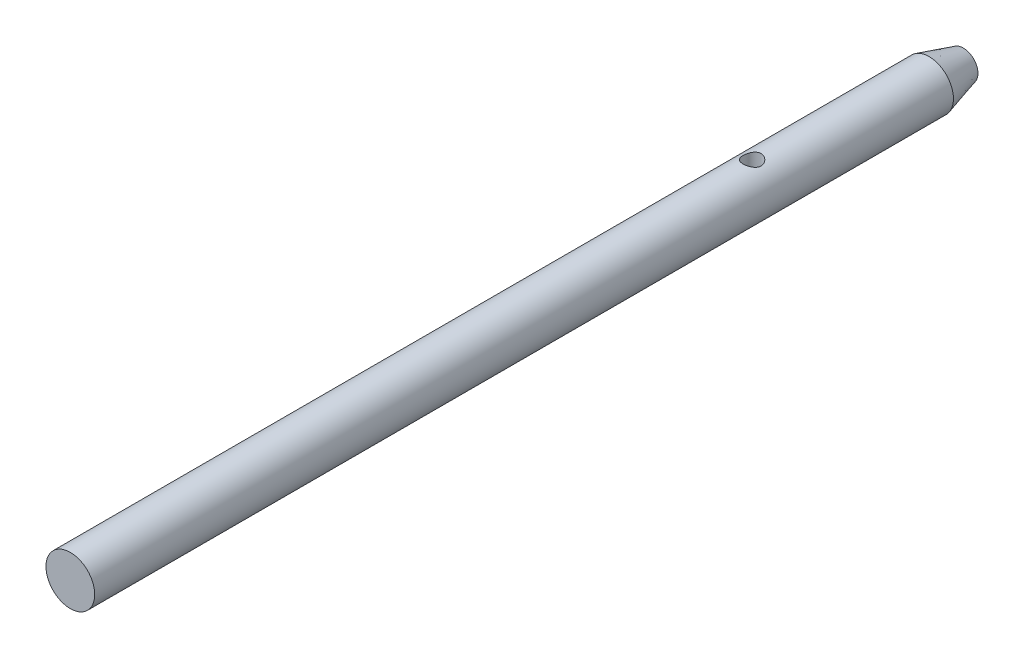
ISO-10303-21;
HEADER;
FILE_DESCRIPTION(('STEP AP214'),'2;1');
FILE_NAME('part.step','',(''),(''),'','','');
FILE_SCHEMA(('AUTOMOTIVE_DESIGN { 1 0 10303 214 1 1 1 1 }'));
ENDSEC;
DATA;
#1=APPLICATION_CONTEXT('core data for automotive mechanical design processes');
#2=APPLICATION_PROTOCOL_DEFINITION('international standard','automotive_design',2000,#1);
#3=PRODUCT_CONTEXT('',#1,'mechanical');
#4=PRODUCT('Part','Part','',(#3));
#5=PRODUCT_RELATED_PRODUCT_CATEGORY('part','',(#4));
#6=PRODUCT_DEFINITION_FORMATION('','',#4);
#7=PRODUCT_DEFINITION_CONTEXT('part definition',#1,'design');
#8=PRODUCT_DEFINITION('design','',#6,#7);
#9=PRODUCT_DEFINITION_SHAPE('','',#8);
#10=(LENGTH_UNIT() NAMED_UNIT(*) SI_UNIT(.MILLI.,.METRE.));
#11=(NAMED_UNIT(*) PLANE_ANGLE_UNIT() SI_UNIT($,.RADIAN.));
#12=(NAMED_UNIT(*) SI_UNIT($,.STERADIAN.) SOLID_ANGLE_UNIT());
#13=UNCERTAINTY_MEASURE_WITH_UNIT(LENGTH_MEASURE(1.E-05),#10,'distance_accuracy_value','');
#14=(GEOMETRIC_REPRESENTATION_CONTEXT(3) GLOBAL_UNCERTAINTY_ASSIGNED_CONTEXT((#13)) GLOBAL_UNIT_ASSIGNED_CONTEXT((#10,
#11,#12)) REPRESENTATION_CONTEXT('',''));
#15=CARTESIAN_POINT('',(0.,0.,0.));
#16=DIRECTION('',(0.,0.,1.));
#17=DIRECTION('',(1.,0.,0.));
#18=AXIS2_PLACEMENT_3D('',#15,#16,#17);
#19=CARTESIAN_POINT('',(0.,0.,78.2));
#20=DIRECTION('',(0.,0.,-1.));
#21=DIRECTION('',(-1.,0.,0.));
#22=AXIS2_PLACEMENT_3D('',#19,#20,#21);
#23=CYLINDRICAL_SURFACE('',#22,2.135);
#24=CARTESIAN_POINT('',(0.,-2.135,19.29));
#25=CARTESIAN_POINT('',(-0.0428238272525146,-2.1350009940098,19.2900013401032));
#26=CARTESIAN_POINT('',(-0.085638357309757,-2.1337002612511,19.2865070010426));
#27=CARTESIAN_POINT('',(-0.169990093325728,-2.12864112528912,19.2726767903511));
#28=CARTESIAN_POINT('',(-0.211527445228046,-2.12488300399346,19.2623417034779));
#29=CARTESIAN_POINT('',(-0.292096286958867,-2.11531311575473,19.2352440665917));
#30=CARTESIAN_POINT('',(-0.331132368726044,-2.10950524735474,19.2184937130613));
#31=CARTESIAN_POINT('',(-0.405838231838684,-2.09641609464971,19.179102199385));
#32=CARTESIAN_POINT('',(-0.441507132774192,-2.08913442654936,19.1564595043622));
#33=CARTESIAN_POINT('',(-0.509946974480535,-2.07351338662565,19.1049435094094));
#34=CARTESIAN_POINT('',(-0.542559501226242,-2.06514462926806,19.0758687440301));
#35=CARTESIAN_POINT('',(-0.602572539428274,-2.04843928389962,19.0127416591513));
#36=CARTESIAN_POINT('',(-0.629971516065413,-2.04010270606756,18.9786878790791));
#37=CARTESIAN_POINT('',(-0.679773875960378,-2.02406609291131,18.9050369260246));
#38=CARTESIAN_POINT('',(-0.701955732021397,-2.01640087631867,18.8652816203101));
#39=CARTESIAN_POINT('',(-0.739248245154464,-2.00303081190102,18.7822761745771));
#40=CARTESIAN_POINT('',(-0.754361641878282,-1.99732520478256,18.7390273962224));
#41=CARTESIAN_POINT('',(-0.77646666746385,-1.98883394910982,18.6520839605847));
#42=CARTESIAN_POINT('',(-0.783760003468851,-1.9859402684505,18.6084769127366));
#43=CARTESIAN_POINT('',(-0.790961267136431,-1.98308390868599,18.5205692854069));
#44=CARTESIAN_POINT('',(-0.790872142551026,-1.98312005972448,18.4762689897974));
#45=CARTESIAN_POINT('',(-0.783542156409132,-1.98602593820376,18.3909682173418));
#46=CARTESIAN_POINT('',(-0.776716560523546,-1.98873113118037,18.3499254196212));
#47=CARTESIAN_POINT('',(-0.756792752812186,-1.99639737240981,18.2696154024085));
#48=CARTESIAN_POINT('',(-0.743693621648512,-2.00135875128379,18.2303484440751));
#49=CARTESIAN_POINT('',(-0.71136124656501,-2.01307961097668,18.1538464392683));
#50=CARTESIAN_POINT('',(-0.692018430804901,-2.01987082265867,18.1166627767925));
#51=CARTESIAN_POINT('',(-0.647824079050184,-2.03447524644867,18.0459472008045));
#52=CARTESIAN_POINT('',(-0.622970676916933,-2.04228880440199,18.0124165301142));
#53=CARTESIAN_POINT('',(-0.566549083268955,-2.05868010145001,17.9476555665624));
#54=CARTESIAN_POINT('',(-0.534648400066002,-2.0672744243697,17.9167184528563));
#55=CARTESIAN_POINT('',(-0.466011737558566,-2.08381932168957,17.8605471978208));
#56=CARTESIAN_POINT('',(-0.429275055022359,-2.09176980219265,17.8353138873685));
#57=CARTESIAN_POINT('',(-0.351277286357768,-2.1062819256944,17.7909545383481));
#58=CARTESIAN_POINT('',(-0.309957626515841,-2.11282143315577,17.7719237361247));
#59=CARTESIAN_POINT('',(-0.22440127916676,-2.1236110947878,17.7411799790662));
#60=CARTESIAN_POINT('',(-0.180165860824172,-2.12786223774206,17.7294638632647));
#61=CARTESIAN_POINT('',(-0.0925029531778528,-2.1334236160906,17.7142401162244));
#62=CARTESIAN_POINT('',(-0.0491529536443193,-2.13487521076022,17.7103375278892));
#63=CARTESIAN_POINT('',(0.0376016534118486,-2.13510916486143,17.7097046980336));
#64=CARTESIAN_POINT('',(0.0810062472026761,-2.13389209764641,17.7129729158887));
#65=CARTESIAN_POINT('',(0.164947028448631,-2.12901880141476,17.7262870400513));
#66=CARTESIAN_POINT('',(0.205529853835498,-2.1254550058492,17.7360762592276));
#67=CARTESIAN_POINT('',(0.284450114556467,-2.11633938227223,17.7618186742843));
#68=CARTESIAN_POINT('',(0.322787256965835,-2.11078729557896,17.7777726722399));
#69=CARTESIAN_POINT('',(0.397376361250218,-2.0980445618673,17.8158967025966));
#70=CARTESIAN_POINT('',(0.43353526677633,-2.09081096072883,17.838234005388));
#71=CARTESIAN_POINT('',(0.501711238114375,-2.07550803529028,17.8883006531025));
#72=CARTESIAN_POINT('',(0.533726796945283,-2.06743840882917,17.9160319507536));
#73=CARTESIAN_POINT('',(0.594596845798324,-2.05078801172393,17.97794301208));
#74=CARTESIAN_POINT('',(0.623170812261933,-2.04220410524591,18.0123984525931));
#75=CARTESIAN_POINT('',(0.674184074189231,-2.02593678452183,18.0857865449927));
#76=CARTESIAN_POINT('',(0.696622894927866,-2.01825343998569,18.1247195430125));
#77=CARTESIAN_POINT('',(0.734732194833676,-2.00469605337354,18.2062344042863));
#78=CARTESIAN_POINT('',(0.750380651462302,-1.99882791579257,18.2488276111607));
#79=CARTESIAN_POINT('',(0.774184352563577,-1.98973091686073,18.3363211483014));
#80=CARTESIAN_POINT('',(0.782344066905023,-1.98650048124964,18.3812200854041));
#81=CARTESIAN_POINT('',(0.790544989748982,-1.98325016337511,18.4690199820063));
#82=CARTESIAN_POINT('',(0.791062925351209,-1.98304176816561,18.5118698191028));
#83=CARTESIAN_POINT('',(0.785180987190091,-1.98537795865399,18.5970114384919));
#84=CARTESIAN_POINT('',(0.778781734233246,-1.98792229729845,18.6393032705198));
#85=CARTESIAN_POINT('',(0.759614417893488,-1.99532229831176,18.720889328424));
#86=CARTESIAN_POINT('',(0.747035916789874,-2.00010898038455,18.7602348755795));
#87=CARTESIAN_POINT('',(0.716032262318212,-2.01141585481088,18.8362812631782));
#88=CARTESIAN_POINT('',(0.697605649861772,-2.0179364797127,18.8729814408015));
#89=CARTESIAN_POINT('',(0.654328772892164,-2.03239368747917,18.9447457343013));
#90=CARTESIAN_POINT('',(0.629196981181888,-2.04038582892592,18.9796287557718));
#91=CARTESIAN_POINT('',(0.573663824928454,-2.05668945480902,19.0448349487086));
#92=CARTESIAN_POINT('',(0.54326080829938,-2.06500103872617,19.0751566850142));
#93=CARTESIAN_POINT('',(0.476152929516309,-2.08152744529652,19.1319889157094));
#94=CARTESIAN_POINT('',(0.439202195132158,-2.08971464340947,19.1582183778302));
#95=CARTESIAN_POINT('',(0.361131124585872,-2.10461087772527,19.204083562761));
#96=CARTESIAN_POINT('',(0.320010649510992,-2.11131986465864,19.2237190658025));
#97=CARTESIAN_POINT('',(0.23334390006495,-2.12267357415785,19.2562136303387));
#98=CARTESIAN_POINT('',(0.187697765137357,-2.12724489208271,19.268834198597));
#99=CARTESIAN_POINT('',(0.0946967591149705,-2.13340685821257,19.2857246889787));
#100=CARTESIAN_POINT('',(0.0473426981359786,-2.13499890109995,19.289998518486));
#101=CARTESIAN_POINT('',(0.,-2.135,19.29));
#102=B_SPLINE_CURVE_WITH_KNOTS('',3,(#24,#25,#26,#27,#28,#29,#30,#31,#32,#33,#34,#35,#36,#37,
#38,#39,#40,#41,#42,#43,#44,#45,#46,#47,#48,#49,#50,#51,#52,#53,#54,#55,#56,#57,#58,#59,#60,#61,
#62,#63,#64,#65,#66,#67,#68,#69,#70,#71,#72,#73,#74,#75,#76,#77,#78,#79,#80,#81,#82,#83,#84,#85,
#86,#87,#88,#89,#90,#91,#92,#93,#94,#95,#96,#97,#98,#99,#100,#101),.UNSPECIFIED.,.T.,.F.,(4,2,2,
2,2,2,2,2,2,2,2,2,2,2,2,2,2,2,2,2,2,2,2,2,2,2,2,2,2,2,2,2,2,2,2,2,2,2,4),(0.,0.128296906151909,
0.256579096872609,0.384618602955328,0.512691495075932,0.645557490133345,0.778462539355701,
0.916269570445694,1.0540231447953,1.18624628604036,1.31841663199489,1.44291805088535,
1.56743772007746,1.6942736561903,1.82115261058118,1.95631650778028,2.09150008173078,
2.22867098807368,2.36578257631508,2.49576835788818,2.62572621517235,2.75084900285138,
2.87598807524934,3.00476618121446,3.13359099435013,3.26968911584709,3.4057977653605,
3.54234460250331,3.67880988467715,3.80672312123309,3.93462487873572,4.05882725883751,
4.18306065149938,4.31368056914014,4.44434149939483,4.5818128805035,4.7192888429054,
4.86119038481296,5.00302548198714),.UNSPECIFIED.);
#103=CARTESIAN_POINT('',(0.,-2.135,19.29));
#104=VERTEX_POINT('',#103);
#105=EDGE_CURVE('E54',#104,#104,#102,.T.);
#106=ORIENTED_EDGE('',*,*,#105,.F.);
#107=EDGE_LOOP('',(#106));
#108=FACE_BOUND('',#107,.T.);
#109=CARTESIAN_POINT('',(0.,2.135,17.71));
#110=CARTESIAN_POINT('',(0.04282382725251,2.1350009940098,17.7099986598968));
#111=CARTESIAN_POINT('',(0.0856383573097523,2.1337002612511,17.7134929989574));
#112=CARTESIAN_POINT('',(0.169990093325723,2.12864112528912,17.7273232096489));
#113=CARTESIAN_POINT('',(0.211527445228041,2.12488300399346,17.7376582965221));
#114=CARTESIAN_POINT('',(0.292096286958862,2.11531311575473,17.7647559334083));
#115=CARTESIAN_POINT('',(0.331132368726039,2.10950524735474,17.7815062869387));
#116=CARTESIAN_POINT('',(0.405838231838679,2.09641609464971,17.820897800615));
#117=CARTESIAN_POINT('',(0.441507132774188,2.08913442654937,17.8435404956378));
#118=CARTESIAN_POINT('',(0.509946974480531,2.07351338662565,17.8950564905906));
#119=CARTESIAN_POINT('',(0.542559501226237,2.06514462926806,17.9241312559699));
#120=CARTESIAN_POINT('',(0.602572539428269,2.04843928389962,17.9872583408487));
#121=CARTESIAN_POINT('',(0.629971516065409,2.04010270606756,18.0213121209209));
#122=CARTESIAN_POINT('',(0.679773875960374,2.02406609291131,18.0949630739754));
#123=CARTESIAN_POINT('',(0.701955732021394,2.01640087631867,18.1347183796899));
#124=CARTESIAN_POINT('',(0.739248245154461,2.00303081190102,18.2177238254229));
#125=CARTESIAN_POINT('',(0.754361641878278,1.99732520478256,18.2609726037776));
#126=CARTESIAN_POINT('',(0.776466667463845,1.98883394910982,18.3479160394153));
#127=CARTESIAN_POINT('',(0.783760003468847,1.9859402684505,18.3915230872634));
#128=CARTESIAN_POINT('',(0.790961267136426,1.98308390868599,18.4794307145931));
#129=CARTESIAN_POINT('',(0.790872142551021,1.98312005972448,18.5237310102026));
#130=CARTESIAN_POINT('',(0.783542156409127,1.98602593820376,18.6090317826582));
#131=CARTESIAN_POINT('',(0.776716560523542,1.98873113118037,18.6500745803788));
#132=CARTESIAN_POINT('',(0.756792752812181,1.99639737240981,18.7303845975915));
#133=CARTESIAN_POINT('',(0.743693621648508,2.00135875128379,18.7696515559249));
#134=CARTESIAN_POINT('',(0.711361246565005,2.01307961097669,18.8461535607317));
#135=CARTESIAN_POINT('',(0.692018430804897,2.01987082265867,18.8833372232075));
#136=CARTESIAN_POINT('',(0.647824079050179,2.03447524644867,18.9540527991955));
#137=CARTESIAN_POINT('',(0.622970676916928,2.04228880440199,18.9875834698858));
#138=CARTESIAN_POINT('',(0.566549083268951,2.05868010145001,19.0523444334376));
#139=CARTESIAN_POINT('',(0.534648400066,2.0672744243697,19.0832815471437));
#140=CARTESIAN_POINT('',(0.466011737558565,2.08381932168957,19.1394528021792));
#141=CARTESIAN_POINT('',(0.429275055022358,2.09176980219265,19.1646861126315));
#142=CARTESIAN_POINT('',(0.351277286357766,2.1062819256944,19.2090454616519));
#143=CARTESIAN_POINT('',(0.309957626515838,2.11282143315577,19.2280762638753));
#144=CARTESIAN_POINT('',(0.224401279166757,2.1236110947878,19.2588200209337));
#145=CARTESIAN_POINT('',(0.180165860824168,2.12786223774206,19.2705361367353));
#146=CARTESIAN_POINT('',(0.0925029531778487,2.13342361609059,19.2857598837756));
#147=CARTESIAN_POINT('',(0.0491529536443154,2.13487521076022,19.2896624721108));
#148=CARTESIAN_POINT('',(-0.0376016534118525,2.13510916486143,19.2902953019664));
#149=CARTESIAN_POINT('',(-0.0810062472026801,2.13389209764641,19.2870270841113));
#150=CARTESIAN_POINT('',(-0.164947028448636,2.12901880141476,19.2737129599486));
#151=CARTESIAN_POINT('',(-0.205529853835503,2.1254550058492,19.2639237407724));
#152=CARTESIAN_POINT('',(-0.284450114556471,2.11633938227223,19.2381813257157));
#153=CARTESIAN_POINT('',(-0.322787256965839,2.11078729557896,19.2222273277601));
#154=CARTESIAN_POINT('',(-0.397376361250221,2.0980445618673,19.1841032974034));
#155=CARTESIAN_POINT('',(-0.433535266776332,2.09081096072883,19.161765994612));
#156=CARTESIAN_POINT('',(-0.501711238114377,2.07550803529028,19.1116993468975));
#157=CARTESIAN_POINT('',(-0.533726796945286,2.06743840882917,19.0839680492464));
#158=CARTESIAN_POINT('',(-0.594596845798329,2.05078801172393,19.02205698792));
#159=CARTESIAN_POINT('',(-0.623170812261938,2.0422041052459,18.9876015474069));
#160=CARTESIAN_POINT('',(-0.674184074189236,2.02593678452183,18.9142134550073));
#161=CARTESIAN_POINT('',(-0.696622894927872,2.01825343998569,18.8752804569875));
#162=CARTESIAN_POINT('',(-0.734732194833681,2.00469605337354,18.7937655957137));
#163=CARTESIAN_POINT('',(-0.750380651462307,1.99882791579257,18.7511723888393));
#164=CARTESIAN_POINT('',(-0.774184352563582,1.98973091686073,18.6636788516986));
#165=CARTESIAN_POINT('',(-0.782344066905027,1.98650048124964,18.6187799145959));
#166=CARTESIAN_POINT('',(-0.790544989748987,1.9832501633751,18.5309800179937));
#167=CARTESIAN_POINT('',(-0.791062925351214,1.98304176816561,18.4881301808972));
#168=CARTESIAN_POINT('',(-0.785180987190095,1.98537795865398,18.4029885615081));
#169=CARTESIAN_POINT('',(-0.778781734233251,1.98792229729845,18.3606967294802));
#170=CARTESIAN_POINT('',(-0.759614417893492,1.99532229831176,18.279110671576));
#171=CARTESIAN_POINT('',(-0.747035916789878,2.00010898038454,18.2397651244205));
#172=CARTESIAN_POINT('',(-0.716032262318217,2.01141585481088,18.1637187368218));
#173=CARTESIAN_POINT('',(-0.697605649861776,2.0179364797127,18.1270185591985));
#174=CARTESIAN_POINT('',(-0.654328772892169,2.03239368747917,18.0552542656987));
#175=CARTESIAN_POINT('',(-0.629196981181893,2.04038582892592,18.0203712442282));
#176=CARTESIAN_POINT('',(-0.573663824928459,2.05668945480902,17.9551650512914));
#177=CARTESIAN_POINT('',(-0.543260808299386,2.06500103872616,17.9248433149858));
#178=CARTESIAN_POINT('',(-0.476152929516314,2.08152744529652,17.8680110842906));
#179=CARTESIAN_POINT('',(-0.439202195132161,2.08971464340947,17.8417816221698));
#180=CARTESIAN_POINT('',(-0.361131124585875,2.10461087772527,17.795916437239));
#181=CARTESIAN_POINT('',(-0.320010649510996,2.11131986465864,17.7762809341975));
#182=CARTESIAN_POINT('',(-0.233343900064955,2.12267357415785,17.7437863696613));
#183=CARTESIAN_POINT('',(-0.187697765137363,2.12724489208271,17.731165801403));
#184=CARTESIAN_POINT('',(-0.0946967591149755,2.13340685821257,17.7142753110213));
#185=CARTESIAN_POINT('',(-0.0473426981359833,2.13499890109995,17.710001481514));
#186=CARTESIAN_POINT('',(0.,2.135,17.71));
#187=B_SPLINE_CURVE_WITH_KNOTS('',3,(#109,#110,#111,#112,#113,#114,#115,#116,#117,#118,#119,
#120,#121,#122,#123,#124,#125,#126,#127,#128,#129,#130,#131,#132,#133,#134,#135,#136,#137,#138,
#139,#140,#141,#142,#143,#144,#145,#146,#147,#148,#149,#150,#151,#152,#153,#154,#155,#156,#157,
#158,#159,#160,#161,#162,#163,#164,#165,#166,#167,#168,#169,#170,#171,#172,#173,#174,#175,#176,
#177,#178,#179,#180,#181,#182,#183,#184,#185,#186),.UNSPECIFIED.,.T.,.F.,(4,2,2,2,2,2,2,2,2,2,2,
2,2,2,2,2,2,2,2,2,2,2,2,2,2,2,2,2,2,2,2,2,2,2,2,2,2,2,4),(0.,0.128296906151909,
0.256579096872608,0.384618602955328,0.512691495075932,0.645557490133345,0.7784625393557,
0.916269570445701,1.0540231447953,1.18624628604036,1.31841663199489,1.44291805088535,
1.56743772007746,1.6942736561903,1.82115261058118,1.95631650778027,2.09150008173078,
2.22867098807368,2.36578257631507,2.49576835788818,2.62572621517235,2.75084900285138,
2.87598807524933,3.00476618121446,3.13359099435012,3.26968911584709,3.4057977653605,
3.54234460250331,3.67880988467715,3.80672312123309,3.93462487873572,4.05882725883751,
4.18306065149938,4.31368056914013,4.44434149939483,4.5818128805035,4.7192888429054,
4.86119038481296,5.00302548198714),.UNSPECIFIED.);
#188=CARTESIAN_POINT('',(0.,2.135,17.71));
#189=VERTEX_POINT('',#188);
#190=EDGE_CURVE('E64',#189,#189,#187,.T.);
#191=ORIENTED_EDGE('',*,*,#190,.T.);
#192=EDGE_LOOP('',(#191));
#193=FACE_BOUND('',#192,.T.);
#194=CARTESIAN_POINT('',(0.,0.,3.));
#195=DIRECTION('',(0.,0.,1.));
#196=DIRECTION('',(1.,0.,0.));
#197=AXIS2_PLACEMENT_3D('',#194,#195,#196);
#198=CIRCLE('',#197,2.135);
#199=CARTESIAN_POINT('',(2.135,0.,3.));
#200=VERTEX_POINT('',#199);
#201=EDGE_CURVE('E46',#200,#200,#198,.T.);
#202=ORIENTED_EDGE('',*,*,#201,.T.);
#203=EDGE_LOOP('',(#202));
#204=FACE_BOUND('',#203,.T.);
#205=CARTESIAN_POINT('',(0.,0.,78.2));
#206=DIRECTION('',(0.,0.,1.));
#207=DIRECTION('',(1.,0.,0.));
#208=AXIS2_PLACEMENT_3D('',#205,#206,#207);
#209=CIRCLE('',#208,2.135);
#210=CARTESIAN_POINT('',(2.135,0.,78.2));
#211=VERTEX_POINT('',#210);
#212=EDGE_CURVE('E50',#211,#211,#209,.T.);
#213=ORIENTED_EDGE('',*,*,#212,.F.);
#214=EDGE_LOOP('',(#213));
#215=FACE_BOUND('',#214,.T.);
#216=ADVANCED_FACE('F39',(#108,#193,#204,#215),#23,.T.);
#217=CARTESIAN_POINT('',(0.,0.,78.2));
#218=DIRECTION('',(0.,0.,1.));
#219=DIRECTION('',(1.,0.,0.));
#220=AXIS2_PLACEMENT_3D('',#217,#218,#219);
#221=PLANE('',#220);
#222=ORIENTED_EDGE('',*,*,#212,.T.);
#223=EDGE_LOOP('',(#222));
#224=FACE_BOUND('',#223,.T.);
#225=ADVANCED_FACE('F78',(#224),#221,.T.);
#226=CARTESIAN_POINT('',(0.,0.,0.));
#227=DIRECTION('',(0.,0.,1.));
#228=DIRECTION('',(1.,0.,0.));
#229=AXIS2_PLACEMENT_3D('',#226,#227,#228);
#230=PLANE('',#229);
#231=CARTESIAN_POINT('',(0.,0.,0.));
#232=DIRECTION('',(0.,0.,1.));
#233=DIRECTION('',(1.,0.,0.));
#234=AXIS2_PLACEMENT_3D('',#231,#232,#233);
#235=CIRCLE('',#234,1.28499999999998);
#236=CARTESIAN_POINT('',(1.28499999999998,0.,0.));
#237=VERTEX_POINT('',#236);
#238=EDGE_CURVE('E10',#237,#237,#235,.F.);
#239=ORIENTED_EDGE('',*,*,#238,.T.);
#240=EDGE_LOOP('',(#239));
#241=FACE_BOUND('',#240,.T.);
#242=ADVANCED_FACE('F81',(#241),#230,.F.);
#243=CARTESIAN_POINT('',(0.,0.,3.));
#244=DIRECTION('',(0.,0.,1.));
#245=DIRECTION('',(1.,0.,0.));
#246=AXIS2_PLACEMENT_3D('',#243,#244,#245);
#247=CONICAL_SURFACE('',#246,2.135,0.276097019395443);
#248=ORIENTED_EDGE('',*,*,#238,.F.);
#249=EDGE_LOOP('',(#248));
#250=FACE_BOUND('',#249,.T.);
#251=ORIENTED_EDGE('',*,*,#201,.F.);
#252=EDGE_LOOP('',(#251));
#253=FACE_BOUND('',#252,.T.);
#254=ADVANCED_FACE('F41',(#250,#253),#247,.T.);
#255=CARTESIAN_POINT('',(0.,-2.136,18.5));
#256=DIRECTION('',(0.,1.,0.));
#257=DIRECTION('',(0.,0.,1.));
#258=AXIS2_PLACEMENT_3D('',#255,#256,#257);
#259=CYLINDRICAL_SURFACE('',#258,0.79);
#260=ORIENTED_EDGE('',*,*,#105,.T.);
#261=EDGE_LOOP('',(#260));
#262=FACE_BOUND('',#261,.T.);
#263=ORIENTED_EDGE('',*,*,#190,.F.);
#264=EDGE_LOOP('',(#263));
#265=FACE_BOUND('',#264,.T.);
#266=ADVANCED_FACE('F70',(#262,#265),#259,.F.);
#267=CLOSED_SHELL('',(#216,#225,#242,#254,#266));
#268=MANIFOLD_SOLID_BREP('B2',#267);
#269=ADVANCED_BREP_SHAPE_REPRESENTATION('',(#18,#268),#14);
#270=SHAPE_DEFINITION_REPRESENTATION(#9,#269);
ENDSEC;
END-ISO-10303-21;
